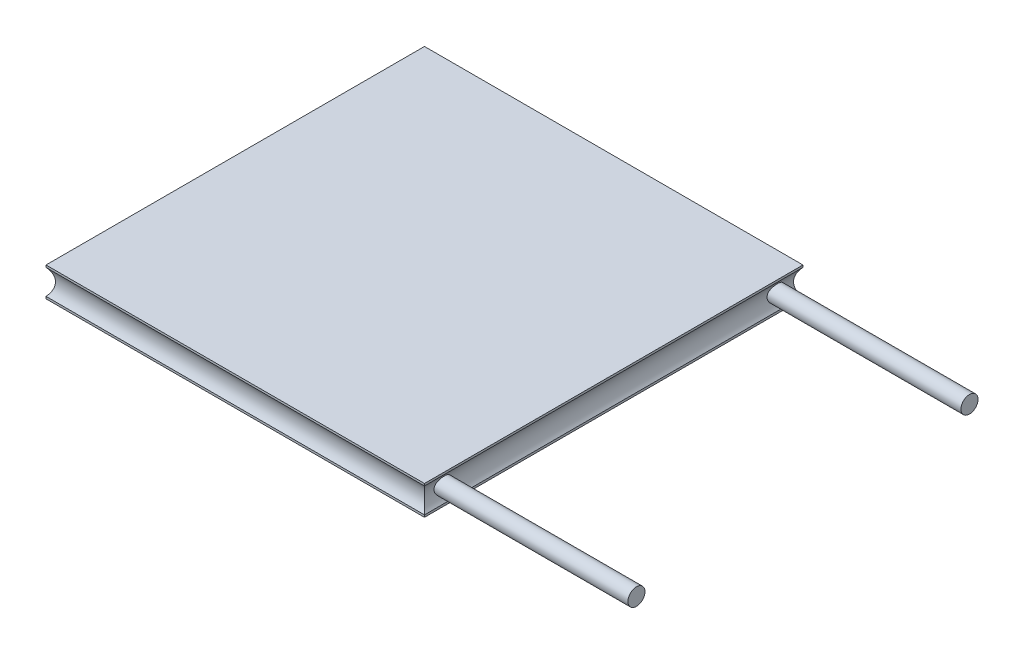
ISO-10303-21;
HEADER;
FILE_DESCRIPTION(('STEP AP214'),'2;1');
FILE_NAME('part.step','',(''),(''),'','','');
FILE_SCHEMA(('AUTOMOTIVE_DESIGN { 1 0 10303 214 1 1 1 1 }'));
ENDSEC;
DATA;
#1=APPLICATION_CONTEXT('core data for automotive mechanical design processes');
#2=APPLICATION_PROTOCOL_DEFINITION('international standard','automotive_design',2000,#1);
#3=PRODUCT_CONTEXT('',#1,'mechanical');
#4=PRODUCT('Part','Part','',(#3));
#5=PRODUCT_RELATED_PRODUCT_CATEGORY('part','',(#4));
#6=PRODUCT_DEFINITION_FORMATION('','',#4);
#7=PRODUCT_DEFINITION_CONTEXT('part definition',#1,'design');
#8=PRODUCT_DEFINITION('design','',#6,#7);
#9=PRODUCT_DEFINITION_SHAPE('','',#8);
#10=(LENGTH_UNIT() NAMED_UNIT(*) SI_UNIT(.MILLI.,.METRE.));
#11=(NAMED_UNIT(*) PLANE_ANGLE_UNIT() SI_UNIT($,.RADIAN.));
#12=(NAMED_UNIT(*) SI_UNIT($,.STERADIAN.) SOLID_ANGLE_UNIT());
#13=UNCERTAINTY_MEASURE_WITH_UNIT(LENGTH_MEASURE(1.E-05),#10,'distance_accuracy_value','');
#14=(GEOMETRIC_REPRESENTATION_CONTEXT(3) GLOBAL_UNCERTAINTY_ASSIGNED_CONTEXT((#13)) GLOBAL_UNIT_ASSIGNED_CONTEXT((#10,
#11,#12)) REPRESENTATION_CONTEXT('',''));
#15=CARTESIAN_POINT('',(0.,0.,0.));
#16=DIRECTION('',(0.,0.,1.));
#17=DIRECTION('',(1.,0.,0.));
#18=AXIS2_PLACEMENT_3D('',#15,#16,#17);
#19=CARTESIAN_POINT('',(40.,0.,17.6));
#20=DIRECTION('',(1.,0.,0.));
#21=DIRECTION('',(0.,0.,-1.));
#22=AXIS2_PLACEMENT_3D('',#19,#20,#21);
#23=PLANE('',#22);
#24=CARTESIAN_POINT('',(40.,0.,17.6));
#25=DIRECTION('',(-1.,0.,0.));
#26=DIRECTION('',(0.,0.,1.));
#27=AXIS2_PLACEMENT_3D('',#24,#25,#26);
#28=CIRCLE('',#27,0.900000000000001);
#29=CARTESIAN_POINT('',(40.,0.,18.5));
#30=VERTEX_POINT('',#29);
#31=EDGE_CURVE('P0_E21',#30,#30,#28,.T.);
#32=ORIENTED_EDGE('',*,*,#31,.F.);
#33=EDGE_LOOP('',(#32));
#34=FACE_BOUND('',#33,.T.);
#35=ADVANCED_FACE('P0_F14',(#34),#23,.T.);
#36=CARTESIAN_POINT('',(0.,0.,17.6));
#37=DIRECTION('',(1.,0.,0.));
#38=DIRECTION('',(0.,0.,-1.));
#39=AXIS2_PLACEMENT_3D('',#36,#37,#38);
#40=PLANE('',#39);
#41=CARTESIAN_POINT('',(0.,0.,17.6));
#42=DIRECTION('',(-1.,0.,0.));
#43=DIRECTION('',(0.,0.,1.));
#44=AXIS2_PLACEMENT_3D('',#41,#42,#43);
#45=CIRCLE('',#44,0.900000000000001);
#46=CARTESIAN_POINT('',(0.,0.,18.5));
#47=VERTEX_POINT('',#46);
#48=EDGE_CURVE('P0_E10',#47,#47,#45,.F.);
#49=ORIENTED_EDGE('',*,*,#48,.F.);
#50=EDGE_LOOP('',(#49));
#51=FACE_BOUND('',#50,.T.);
#52=ADVANCED_FACE('P0_F33',(#51),#40,.F.);
#53=CARTESIAN_POINT('',(40.,0.,17.6));
#54=DIRECTION('',(-1.,0.,0.));
#55=DIRECTION('',(0.,0.,1.));
#56=AXIS2_PLACEMENT_3D('',#53,#54,#55);
#57=CYLINDRICAL_SURFACE('',#56,0.900000000000001);
#58=ORIENTED_EDGE('',*,*,#48,.T.);
#59=EDGE_LOOP('',(#58));
#60=FACE_BOUND('',#59,.T.);
#61=ORIENTED_EDGE('',*,*,#31,.T.);
#62=EDGE_LOOP('',(#61));
#63=FACE_BOUND('',#62,.T.);
#64=ADVANCED_FACE('P0_F30',(#60,#63),#57,.T.);
#65=CLOSED_SHELL('',(#35,#52,#64));
#66=MANIFOLD_SOLID_BREP('P0_B1',#65);
#67=CARTESIAN_POINT('',(0.,-1.55,0.));
#68=DIRECTION('',(0.,-1.,0.));
#69=DIRECTION('',(0.,0.,-1.));
#70=AXIS2_PLACEMENT_3D('',#67,#68,#69);
#71=PLANE('',#70);
#72=DIRECTION('',(0.,0.,-1.));
#73=VECTOR('',#72,1.);
#74=CARTESIAN_POINT('',(-20.,-1.55,20.));
#75=LINE('',#74,#73);
#76=CARTESIAN_POINT('',(-20.,-1.55,20.));
#77=VERTEX_POINT('',#76);
#78=CARTESIAN_POINT('',(-20.,-1.55,-20.));
#79=VERTEX_POINT('',#78);
#80=EDGE_CURVE('P1_E147',#77,#79,#75,.T.);
#81=ORIENTED_EDGE('',*,*,#80,.T.);
#82=DIRECTION('',(1.,0.,0.));
#83=VECTOR('',#82,1.);
#84=CARTESIAN_POINT('',(-20.,-1.55,-20.));
#85=LINE('',#84,#83);
#86=CARTESIAN_POINT('',(20.,-1.55,-20.));
#87=VERTEX_POINT('',#86);
#88=EDGE_CURVE('P1_E141',#79,#87,#85,.T.);
#89=ORIENTED_EDGE('',*,*,#88,.T.);
#90=DIRECTION('',(0.,0.,1.));
#91=VECTOR('',#90,1.);
#92=CARTESIAN_POINT('',(20.,-1.55,20.));
#93=LINE('',#92,#91);
#94=CARTESIAN_POINT('',(20.,-1.55,20.));
#95=VERTEX_POINT('',#94);
#96=EDGE_CURVE('P1_E135',#87,#95,#93,.T.);
#97=ORIENTED_EDGE('',*,*,#96,.T.);
#98=DIRECTION('',(-1.,0.,0.));
#99=VECTOR('',#98,1.);
#100=CARTESIAN_POINT('',(-20.,-1.55,20.));
#101=LINE('',#100,#99);
#102=EDGE_CURVE('P1_E158',#95,#77,#101,.T.);
#103=ORIENTED_EDGE('',*,*,#102,.T.);
#104=EDGE_LOOP('',(#81,#89,#97,#103));
#105=FACE_BOUND('',#104,.T.);
#106=ADVANCED_FACE('P1_F16',(#105),#71,.T.);
#107=CARTESIAN_POINT('',(-20.,1.55,20.));
#108=DIRECTION('',(0.,0.,-1.));
#109=DIRECTION('',(-1.,0.,0.));
#110=AXIS2_PLACEMENT_3D('',#107,#108,#109);
#111=PLANE('',#110);
#112=DIRECTION('',(1.,0.,0.));
#113=VECTOR('',#112,1.);
#114=CARTESIAN_POINT('',(-23.95,-1.3228756555323,20.));
#115=LINE('',#114,#113);
#116=CARTESIAN_POINT('',(20.,-1.32287565553231,20.));
#117=VERTEX_POINT('',#116);
#118=CARTESIAN_POINT('',(-20.,-1.3228756555323,20.));
#119=VERTEX_POINT('',#118);
#120=EDGE_CURVE('P1_E87',#117,#119,#115,.F.);
#121=ORIENTED_EDGE('',*,*,#120,.T.);
#122=DIRECTION('',(0.,1.,0.));
#123=VECTOR('',#122,1.);
#124=CARTESIAN_POINT('',(-20.,1.55,20.));
#125=LINE('',#124,#123);
#126=EDGE_CURVE('P1_E144',#119,#77,#125,.F.);
#127=ORIENTED_EDGE('',*,*,#126,.T.);
#128=ORIENTED_EDGE('',*,*,#102,.F.);
#129=DIRECTION('',(0.,1.,0.));
#130=VECTOR('',#129,1.);
#131=CARTESIAN_POINT('',(20.,1.55,20.));
#132=LINE('',#131,#130);
#133=EDGE_CURVE('P1_E130',#95,#117,#132,.T.);
#134=ORIENTED_EDGE('',*,*,#133,.T.);
#135=EDGE_LOOP('',(#121,#127,#128,#134));
#136=FACE_BOUND('',#135,.T.);
#137=ADVANCED_FACE('P1_F245',(#136),#111,.F.);
#138=CARTESIAN_POINT('',(-20.,1.55,20.));
#139=DIRECTION('',(1.,0.,0.));
#140=DIRECTION('',(0.,0.,-1.));
#141=AXIS2_PLACEMENT_3D('',#138,#139,#140);
#142=PLANE('',#141);
#143=DIRECTION('',(0.,0.,1.));
#144=VECTOR('',#143,1.);
#145=CARTESIAN_POINT('',(-20.,-1.3228756555323,-23.95));
#146=LINE('',#145,#144);
#147=CARTESIAN_POINT('',(-20.,-1.32287565553231,-20.));
#148=VERTEX_POINT('',#147);
#149=EDGE_CURVE('P1_E85',#119,#148,#146,.F.);
#150=ORIENTED_EDGE('',*,*,#149,.T.);
#151=DIRECTION('',(0.,1.,0.));
#152=VECTOR('',#151,1.);
#153=CARTESIAN_POINT('',(-20.,1.55,-20.));
#154=LINE('',#153,#152);
#155=EDGE_CURVE('P1_E138',#148,#79,#154,.F.);
#156=ORIENTED_EDGE('',*,*,#155,.T.);
#157=ORIENTED_EDGE('',*,*,#80,.F.);
#158=ORIENTED_EDGE('',*,*,#126,.F.);
#159=EDGE_LOOP('',(#150,#156,#157,#158));
#160=FACE_BOUND('',#159,.T.);
#161=ADVANCED_FACE('P1_F178',(#160),#142,.F.);
#162=CARTESIAN_POINT('',(-20.,1.55,-20.));
#163=DIRECTION('',(0.,0.,1.));
#164=DIRECTION('',(1.,0.,0.));
#165=AXIS2_PLACEMENT_3D('',#162,#163,#164);
#166=PLANE('',#165);
#167=DIRECTION('',(-1.,0.,0.));
#168=VECTOR('',#167,1.);
#169=CARTESIAN_POINT('',(23.95,-1.32287565553231,-20.));
#170=LINE('',#169,#168);
#171=CARTESIAN_POINT('',(20.,-1.32287565553231,-20.));
#172=VERTEX_POINT('',#171);
#173=EDGE_CURVE('P1_E171',#148,#172,#170,.F.);
#174=ORIENTED_EDGE('',*,*,#173,.T.);
#175=DIRECTION('',(0.,1.,0.));
#176=VECTOR('',#175,1.);
#177=CARTESIAN_POINT('',(20.,1.55,-20.));
#178=LINE('',#177,#176);
#179=EDGE_CURVE('P1_E125',#172,#87,#178,.F.);
#180=ORIENTED_EDGE('',*,*,#179,.T.);
#181=ORIENTED_EDGE('',*,*,#88,.F.);
#182=ORIENTED_EDGE('',*,*,#155,.F.);
#183=EDGE_LOOP('',(#174,#180,#181,#182));
#184=FACE_BOUND('',#183,.T.);
#185=ADVANCED_FACE('P1_F184',(#184),#166,.F.);
#186=CARTESIAN_POINT('',(20.,1.55,20.));
#187=DIRECTION('',(-1.,0.,0.));
#188=DIRECTION('',(0.,0.,1.));
#189=AXIS2_PLACEMENT_3D('',#186,#187,#188);
#190=PLANE('',#189);
#191=DIRECTION('',(0.,0.,-1.));
#192=VECTOR('',#191,1.);
#193=CARTESIAN_POINT('',(20.,-1.32287565553232,23.95));
#194=LINE('',#193,#192);
#195=EDGE_CURVE('P1_E168',#172,#117,#194,.F.);
#196=ORIENTED_EDGE('',*,*,#195,.T.);
#197=ORIENTED_EDGE('',*,*,#133,.F.);
#198=ORIENTED_EDGE('',*,*,#96,.F.);
#199=ORIENTED_EDGE('',*,*,#179,.F.);
#200=EDGE_LOOP('',(#196,#197,#198,#199));
#201=FACE_BOUND('',#200,.T.);
#202=ADVANCED_FACE('P1_F239',(#201),#190,.F.);
#203=CARTESIAN_POINT('',(-23.95,0.,21.5));
#204=DIRECTION('',(1.,0.,0.));
#205=DIRECTION('',(0.,0.,-1.));
#206=AXIS2_PLACEMENT_3D('',#203,#204,#205);
#207=CYLINDRICAL_SURFACE('',#206,2.);
#208=ORIENTED_EDGE('',*,*,#120,.F.);
#209=CARTESIAN_POINT('',(21.5,0.,21.5));
#210=DIRECTION('',(0.707106781186548,0.,-0.707106781186547));
#211=DIRECTION('',(0.707106781186547,0.,0.707106781186548));
#212=AXIS2_PLACEMENT_3D('',#209,#210,#211);
#213=ELLIPSE('',#212,2.82842712474619,2.);
#214=CARTESIAN_POINT('',(20.,1.32287565553231,20.));
#215=VERTEX_POINT('',#214);
#216=EDGE_CURVE('P1_E92',#117,#215,#213,.T.);
#217=ORIENTED_EDGE('',*,*,#216,.T.);
#218=DIRECTION('',(-1.,0.,0.));
#219=VECTOR('',#218,1.);
#220=CARTESIAN_POINT('',(-20.,1.32287565553231,20.));
#221=LINE('',#220,#219);
#222=CARTESIAN_POINT('',(-20.,1.3228756555323,20.));
#223=VERTEX_POINT('',#222);
#224=EDGE_CURVE('P1_E89',#215,#223,#221,.T.);
#225=ORIENTED_EDGE('',*,*,#224,.T.);
#226=CARTESIAN_POINT('',(-21.5,0.,21.5));
#227=DIRECTION('',(0.707106781186547,0.,0.707106781186548));
#228=DIRECTION('',(0.707106781186548,0.,-0.707106781186547));
#229=AXIS2_PLACEMENT_3D('',#226,#227,#228);
#230=ELLIPSE('',#229,2.82842712474619,2.);
#231=EDGE_CURVE('P1_E19',#223,#119,#230,.F.);
#232=ORIENTED_EDGE('',*,*,#231,.T.);
#233=EDGE_LOOP('',(#208,#217,#225,#232));
#234=FACE_BOUND('',#233,.T.);
#235=ADVANCED_FACE('P1_F90',(#234),#207,.F.);
#236=CARTESIAN_POINT('',(-21.5,0.,-23.95));
#237=DIRECTION('',(0.,0.,1.));
#238=DIRECTION('',(1.,0.,0.));
#239=AXIS2_PLACEMENT_3D('',#236,#237,#238);
#240=CYLINDRICAL_SURFACE('',#239,2.);
#241=ORIENTED_EDGE('',*,*,#149,.F.);
#242=ORIENTED_EDGE('',*,*,#231,.F.);
#243=DIRECTION('',(0.,0.,-1.));
#244=VECTOR('',#243,1.);
#245=CARTESIAN_POINT('',(-20.,1.32287565553231,20.));
#246=LINE('',#245,#244);
#247=CARTESIAN_POINT('',(-20.,1.32287565553231,-20.));
#248=VERTEX_POINT('',#247);
#249=EDGE_CURVE('P1_E82',#223,#248,#246,.T.);
#250=ORIENTED_EDGE('',*,*,#249,.T.);
#251=CARTESIAN_POINT('',(-21.5,0.,-21.5));
#252=DIRECTION('',(-0.707106781186547,0.,0.707106781186547));
#253=DIRECTION('',(0.707106781186547,0.,0.707106781186547));
#254=AXIS2_PLACEMENT_3D('',#251,#252,#253);
#255=ELLIPSE('',#254,2.82842712474619,2.);
#256=EDGE_CURVE('P1_E172',#248,#148,#255,.F.);
#257=ORIENTED_EDGE('',*,*,#256,.T.);
#258=EDGE_LOOP('',(#241,#242,#250,#257));
#259=FACE_BOUND('',#258,.T.);
#260=ADVANCED_FACE('P1_F79',(#259),#240,.F.);
#261=CARTESIAN_POINT('',(23.95,0.,-21.5));
#262=DIRECTION('',(-1.,0.,0.));
#263=DIRECTION('',(0.,0.,1.));
#264=AXIS2_PLACEMENT_3D('',#261,#262,#263);
#265=CYLINDRICAL_SURFACE('',#264,2.);
#266=ORIENTED_EDGE('',*,*,#173,.F.);
#267=ORIENTED_EDGE('',*,*,#256,.F.);
#268=DIRECTION('',(1.,0.,0.));
#269=VECTOR('',#268,1.);
#270=CARTESIAN_POINT('',(-20.,1.32287565553231,-20.));
#271=LINE('',#270,#269);
#272=CARTESIAN_POINT('',(20.,1.32287565553231,-20.));
#273=VERTEX_POINT('',#272);
#274=EDGE_CURVE('P1_E195',#248,#273,#271,.T.);
#275=ORIENTED_EDGE('',*,*,#274,.T.);
#276=CARTESIAN_POINT('',(21.5,0.,-21.5));
#277=DIRECTION('',(-0.707106781186547,0.,-0.707106781186547));
#278=DIRECTION('',(-0.707106781186547,0.,0.707106781186547));
#279=AXIS2_PLACEMENT_3D('',#276,#277,#278);
#280=ELLIPSE('',#279,2.82842712474619,2.);
#281=EDGE_CURVE('P1_E169',#273,#172,#280,.F.);
#282=ORIENTED_EDGE('',*,*,#281,.T.);
#283=EDGE_LOOP('',(#266,#267,#275,#282));
#284=FACE_BOUND('',#283,.T.);
#285=ADVANCED_FACE('P1_F180',(#284),#265,.F.);
#286=CARTESIAN_POINT('',(21.5,0.,23.95));
#287=DIRECTION('',(0.,0.,-1.));
#288=DIRECTION('',(-1.,0.,0.));
#289=AXIS2_PLACEMENT_3D('',#286,#287,#288);
#290=CYLINDRICAL_SURFACE('',#289,2.);
#291=ORIENTED_EDGE('',*,*,#195,.F.);
#292=ORIENTED_EDGE('',*,*,#281,.F.);
#293=DIRECTION('',(0.,0.,1.));
#294=VECTOR('',#293,1.);
#295=CARTESIAN_POINT('',(20.,1.32287565553232,20.));
#296=LINE('',#295,#294);
#297=EDGE_CURVE('P1_E194',#273,#215,#296,.T.);
#298=ORIENTED_EDGE('',*,*,#297,.T.);
#299=ORIENTED_EDGE('',*,*,#216,.F.);
#300=EDGE_LOOP('',(#291,#292,#298,#299));
#301=FACE_BOUND('',#300,.T.);
#302=ADVANCED_FACE('P1_F187',(#301),#290,.F.);
#303=CARTESIAN_POINT('',(-20.,1.55,20.));
#304=DIRECTION('',(0.,0.,-1.));
#305=DIRECTION('',(-1.,0.,0.));
#306=AXIS2_PLACEMENT_3D('',#303,#304,#305);
#307=PLANE('',#306);
#308=ORIENTED_EDGE('',*,*,#224,.F.);
#309=DIRECTION('',(0.,1.,0.));
#310=VECTOR('',#309,1.);
#311=CARTESIAN_POINT('',(20.,1.55,20.));
#312=LINE('',#311,#310);
#313=CARTESIAN_POINT('',(20.,1.55,20.));
#314=VERTEX_POINT('',#313);
#315=EDGE_CURVE('P1_E120',#215,#314,#312,.T.);
#316=ORIENTED_EDGE('',*,*,#315,.T.);
#317=DIRECTION('',(1.,0.,0.));
#318=VECTOR('',#317,1.);
#319=CARTESIAN_POINT('',(0.,1.55,20.));
#320=LINE('',#319,#318);
#321=CARTESIAN_POINT('',(-20.,1.55,20.));
#322=VERTEX_POINT('',#321);
#323=EDGE_CURVE('P1_E109',#314,#322,#320,.F.);
#324=ORIENTED_EDGE('',*,*,#323,.T.);
#325=DIRECTION('',(0.,1.,0.));
#326=VECTOR('',#325,1.);
#327=CARTESIAN_POINT('',(-20.,1.55,20.));
#328=LINE('',#327,#326);
#329=EDGE_CURVE('P1_E97',#322,#223,#328,.F.);
#330=ORIENTED_EDGE('',*,*,#329,.T.);
#331=EDGE_LOOP('',(#308,#316,#324,#330));
#332=FACE_BOUND('',#331,.T.);
#333=ADVANCED_FACE('P1_F107',(#332),#307,.F.);
#334=CARTESIAN_POINT('',(-20.,1.55,20.));
#335=DIRECTION('',(1.,0.,0.));
#336=DIRECTION('',(0.,0.,-1.));
#337=AXIS2_PLACEMENT_3D('',#334,#335,#336);
#338=PLANE('',#337);
#339=ORIENTED_EDGE('',*,*,#249,.F.);
#340=ORIENTED_EDGE('',*,*,#329,.F.);
#341=DIRECTION('',(0.,0.,-1.));
#342=VECTOR('',#341,1.);
#343=CARTESIAN_POINT('',(-20.,1.55,0.));
#344=LINE('',#343,#342);
#345=CARTESIAN_POINT('',(-20.,1.55,-20.));
#346=VERTEX_POINT('',#345);
#347=EDGE_CURVE('P1_E119',#322,#346,#344,.T.);
#348=ORIENTED_EDGE('',*,*,#347,.T.);
#349=DIRECTION('',(0.,1.,0.));
#350=VECTOR('',#349,1.);
#351=CARTESIAN_POINT('',(-20.,1.55,-20.));
#352=LINE('',#351,#350);
#353=EDGE_CURVE('P1_E104',#346,#248,#352,.F.);
#354=ORIENTED_EDGE('',*,*,#353,.T.);
#355=EDGE_LOOP('',(#339,#340,#348,#354));
#356=FACE_BOUND('',#355,.T.);
#357=ADVANCED_FACE('P1_F101',(#356),#338,.F.);
#358=CARTESIAN_POINT('',(-20.,1.55,-20.));
#359=DIRECTION('',(0.,0.,1.));
#360=DIRECTION('',(1.,0.,0.));
#361=AXIS2_PLACEMENT_3D('',#358,#359,#360);
#362=PLANE('',#361);
#363=ORIENTED_EDGE('',*,*,#274,.F.);
#364=ORIENTED_EDGE('',*,*,#353,.F.);
#365=DIRECTION('',(1.,0.,0.));
#366=VECTOR('',#365,1.);
#367=CARTESIAN_POINT('',(0.,1.55,-20.));
#368=LINE('',#367,#366);
#369=CARTESIAN_POINT('',(20.,1.55,-20.));
#370=VERTEX_POINT('',#369);
#371=EDGE_CURVE('P1_E25',#346,#370,#368,.T.);
#372=ORIENTED_EDGE('',*,*,#371,.T.);
#373=DIRECTION('',(0.,1.,0.));
#374=VECTOR('',#373,1.);
#375=CARTESIAN_POINT('',(20.,1.55,-20.));
#376=LINE('',#375,#374);
#377=EDGE_CURVE('P1_E33',#370,#273,#376,.F.);
#378=ORIENTED_EDGE('',*,*,#377,.T.);
#379=EDGE_LOOP('',(#363,#364,#372,#378));
#380=FACE_BOUND('',#379,.T.);
#381=ADVANCED_FACE('P1_F215',(#380),#362,.F.);
#382=CARTESIAN_POINT('',(20.,1.55,20.));
#383=DIRECTION('',(-1.,0.,0.));
#384=DIRECTION('',(0.,0.,1.));
#385=AXIS2_PLACEMENT_3D('',#382,#383,#384);
#386=PLANE('',#385);
#387=ORIENTED_EDGE('',*,*,#297,.F.);
#388=ORIENTED_EDGE('',*,*,#377,.F.);
#389=DIRECTION('',(0.,0.,-1.));
#390=VECTOR('',#389,1.);
#391=CARTESIAN_POINT('',(20.,1.55,0.));
#392=LINE('',#391,#390);
#393=EDGE_CURVE('P1_E11',#370,#314,#392,.F.);
#394=ORIENTED_EDGE('',*,*,#393,.T.);
#395=ORIENTED_EDGE('',*,*,#315,.F.);
#396=EDGE_LOOP('',(#387,#388,#394,#395));
#397=FACE_BOUND('',#396,.T.);
#398=ADVANCED_FACE('P1_F216',(#397),#386,.F.);
#399=CARTESIAN_POINT('',(0.,1.55,0.));
#400=DIRECTION('',(0.,-1.,0.));
#401=DIRECTION('',(0.,0.,-1.));
#402=AXIS2_PLACEMENT_3D('',#399,#400,#401);
#403=PLANE('',#402);
#404=ORIENTED_EDGE('',*,*,#371,.F.);
#405=ORIENTED_EDGE('',*,*,#347,.F.);
#406=ORIENTED_EDGE('',*,*,#323,.F.);
#407=ORIENTED_EDGE('',*,*,#393,.F.);
#408=EDGE_LOOP('',(#404,#405,#406,#407));
#409=FACE_BOUND('',#408,.T.);
#410=ADVANCED_FACE('P1_F213',(#409),#403,.F.);
#411=CLOSED_SHELL('',(#106,#137,#161,#185,#202,#235,#260,#285,#302,#333,#357,#381,#398,#410));
#412=MANIFOLD_SOLID_BREP('P1_B1',#411);
#413=CARTESIAN_POINT('',(40.,0.,-17.6));
#414=DIRECTION('',(-1.,0.,0.));
#415=DIRECTION('',(0.,0.,1.));
#416=AXIS2_PLACEMENT_3D('',#413,#414,#415);
#417=PLANE('',#416);
#418=CARTESIAN_POINT('',(40.,0.,-17.6));
#419=DIRECTION('',(-1.,0.,0.));
#420=DIRECTION('',(0.,0.,1.));
#421=AXIS2_PLACEMENT_3D('',#418,#419,#420);
#422=CIRCLE('',#421,0.900000000000001);
#423=CARTESIAN_POINT('',(40.,0.,-16.7));
#424=VERTEX_POINT('',#423);
#425=EDGE_CURVE('P2_E21',#424,#424,#422,.T.);
#426=ORIENTED_EDGE('',*,*,#425,.F.);
#427=EDGE_LOOP('',(#426));
#428=FACE_BOUND('',#427,.T.);
#429=ADVANCED_FACE('P2_F14',(#428),#417,.F.);
#430=CARTESIAN_POINT('',(0.,0.,-17.6));
#431=DIRECTION('',(-1.,0.,0.));
#432=DIRECTION('',(0.,0.,1.));
#433=AXIS2_PLACEMENT_3D('',#430,#431,#432);
#434=PLANE('',#433);
#435=CARTESIAN_POINT('',(0.,0.,-17.6));
#436=DIRECTION('',(-1.,0.,0.));
#437=DIRECTION('',(0.,0.,1.));
#438=AXIS2_PLACEMENT_3D('',#435,#436,#437);
#439=CIRCLE('',#438,0.900000000000001);
#440=CARTESIAN_POINT('',(0.,0.,-16.7));
#441=VERTEX_POINT('',#440);
#442=EDGE_CURVE('P2_E10',#441,#441,#439,.F.);
#443=ORIENTED_EDGE('',*,*,#442,.F.);
#444=EDGE_LOOP('',(#443));
#445=FACE_BOUND('',#444,.T.);
#446=ADVANCED_FACE('P2_F33',(#445),#434,.T.);
#447=CARTESIAN_POINT('',(40.,0.,-17.6));
#448=DIRECTION('',(-1.,0.,0.));
#449=DIRECTION('',(0.,0.,1.));
#450=AXIS2_PLACEMENT_3D('',#447,#448,#449);
#451=CYLINDRICAL_SURFACE('',#450,0.900000000000001);
#452=ORIENTED_EDGE('',*,*,#442,.T.);
#453=EDGE_LOOP('',(#452));
#454=FACE_BOUND('',#453,.T.);
#455=ORIENTED_EDGE('',*,*,#425,.T.);
#456=EDGE_LOOP('',(#455));
#457=FACE_BOUND('',#456,.T.);
#458=ADVANCED_FACE('P2_F30',(#454,#457),#451,.T.);
#459=CLOSED_SHELL('',(#429,#446,#458));
#460=MANIFOLD_SOLID_BREP('P2_B1',#459);
#461=ADVANCED_BREP_SHAPE_REPRESENTATION('',(#18,#66,#412,#460),#14);
#462=SHAPE_DEFINITION_REPRESENTATION(#9,#461);
ENDSEC;
END-ISO-10303-21;
